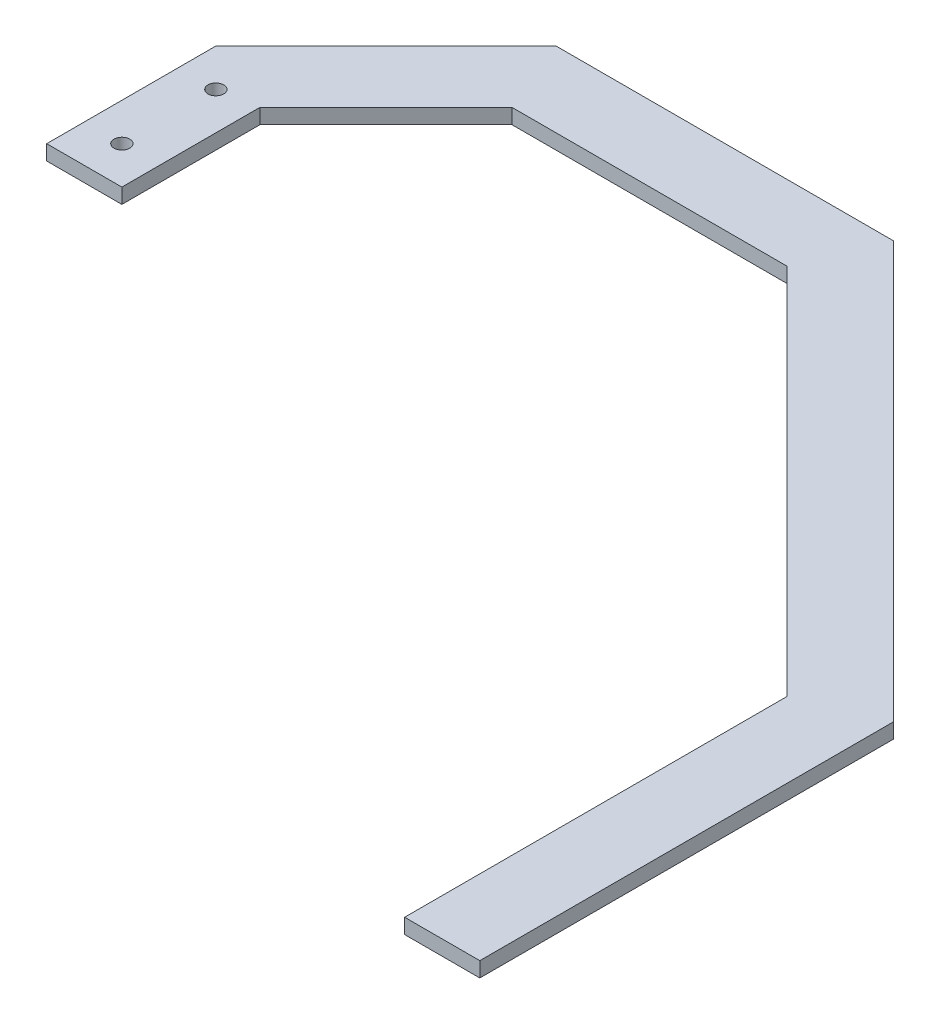
ISO-10303-21;
HEADER;
FILE_DESCRIPTION(('STEP AP214'),'2;1');
FILE_NAME('part.step','',(''),(''),'','','');
FILE_SCHEMA(('AUTOMOTIVE_DESIGN { 1 0 10303 214 1 1 1 1 }'));
ENDSEC;
DATA;
#1=APPLICATION_CONTEXT('core data for automotive mechanical design processes');
#2=APPLICATION_PROTOCOL_DEFINITION('international standard','automotive_design',2000,#1);
#3=PRODUCT_CONTEXT('',#1,'mechanical');
#4=PRODUCT('Part','Part','',(#3));
#5=PRODUCT_RELATED_PRODUCT_CATEGORY('part','',(#4));
#6=PRODUCT_DEFINITION_FORMATION('','',#4);
#7=PRODUCT_DEFINITION_CONTEXT('part definition',#1,'design');
#8=PRODUCT_DEFINITION('design','',#6,#7);
#9=PRODUCT_DEFINITION_SHAPE('','',#8);
#10=(LENGTH_UNIT() NAMED_UNIT(*) SI_UNIT(.MILLI.,.METRE.));
#11=(NAMED_UNIT(*) PLANE_ANGLE_UNIT() SI_UNIT($,.RADIAN.));
#12=(NAMED_UNIT(*) SI_UNIT($,.STERADIAN.) SOLID_ANGLE_UNIT());
#13=UNCERTAINTY_MEASURE_WITH_UNIT(LENGTH_MEASURE(1.E-05),#10,'distance_accuracy_value','');
#14=(GEOMETRIC_REPRESENTATION_CONTEXT(3) GLOBAL_UNCERTAINTY_ASSIGNED_CONTEXT((#13)) GLOBAL_UNIT_ASSIGNED_CONTEXT((#10,
#11,#12)) REPRESENTATION_CONTEXT('',''));
#15=CARTESIAN_POINT('',(0.,0.,0.));
#16=DIRECTION('',(0.,0.,1.));
#17=DIRECTION('',(1.,0.,0.));
#18=AXIS2_PLACEMENT_3D('',#15,#16,#17);
#19=CARTESIAN_POINT('',(0.,4.,0.));
#20=DIRECTION('',(0.,-1.,0.));
#21=DIRECTION('',(0.,0.,-1.));
#22=AXIS2_PLACEMENT_3D('',#19,#20,#21);
#23=PLANE('',#22);
#24=DIRECTION('',(0.,0.,1.));
#25=VECTOR('',#24,1.);
#26=CARTESIAN_POINT('',(0.,4.,0.));
#27=LINE('',#26,#25);
#28=CARTESIAN_POINT('',(0.,4.,-45.));
#29=VERTEX_POINT('',#28);
#30=CARTESIAN_POINT('',(0.,4.,0.));
#31=VERTEX_POINT('',#30);
#32=EDGE_CURVE('E183',#29,#31,#27,.T.);
#33=ORIENTED_EDGE('',*,*,#32,.T.);
#34=DIRECTION('',(1.,0.,0.));
#35=VECTOR('',#34,1.);
#36=CARTESIAN_POINT('',(20.,4.,0.));
#37=LINE('',#36,#35);
#38=CARTESIAN_POINT('',(20.,4.,0.));
#39=VERTEX_POINT('',#38);
#40=EDGE_CURVE('E111',#31,#39,#37,.T.);
#41=ORIENTED_EDGE('',*,*,#40,.T.);
#42=DIRECTION('',(0.,0.,-1.));
#43=VECTOR('',#42,1.);
#44=CARTESIAN_POINT('',(20.,4.,-36.7157287525354));
#45=LINE('',#44,#43);
#46=CARTESIAN_POINT('',(20.,4.,-36.7157287525354));
#47=VERTEX_POINT('',#46);
#48=EDGE_CURVE('E210',#39,#47,#45,.T.);
#49=ORIENTED_EDGE('',*,*,#48,.T.);
#50=DIRECTION('',(0.707106781186538,0.,-0.707106781186557));
#51=VECTOR('',#50,1.);
#52=CARTESIAN_POINT('',(53.5342712474645,4.,-70.2500000000008));
#53=LINE('',#52,#51);
#54=CARTESIAN_POINT('',(53.5342712474645,4.,-70.2500000000008));
#55=VERTEX_POINT('',#54);
#56=EDGE_CURVE('E229',#47,#55,#53,.T.);
#57=ORIENTED_EDGE('',*,*,#56,.T.);
#58=DIRECTION('',(1.,0.,0.));
#59=VECTOR('',#58,1.);
#60=CARTESIAN_POINT('',(126.683311442472,4.,-70.2500000000008));
#61=LINE('',#60,#59);
#62=CARTESIAN_POINT('',(126.683311442472,4.,-70.2500000000008));
#63=VERTEX_POINT('',#62);
#64=EDGE_CURVE('E226',#55,#63,#61,.T.);
#65=ORIENTED_EDGE('',*,*,#64,.T.);
#66=DIRECTION('',(0.707106781186546,0.,0.707106781186549));
#67=VECTOR('',#66,1.);
#68=CARTESIAN_POINT('',(225.824430246232,4.,28.8911188037598));
#69=LINE('',#68,#67);
#70=CARTESIAN_POINT('',(225.824430246232,4.,28.8911188037598));
#71=VERTEX_POINT('',#70);
#72=EDGE_CURVE('E228',#63,#71,#69,.T.);
#73=ORIENTED_EDGE('',*,*,#72,.T.);
#74=DIRECTION('',(0.,0.,1.));
#75=VECTOR('',#74,1.);
#76=CARTESIAN_POINT('',(225.824430246232,4.,130.606847556298));
#77=LINE('',#76,#75);
#78=CARTESIAN_POINT('',(225.824430246232,4.,130.606847556298));
#79=VERTEX_POINT('',#78);
#80=EDGE_CURVE('E231',#71,#79,#77,.T.);
#81=ORIENTED_EDGE('',*,*,#80,.T.);
#82=DIRECTION('',(1.,0.,0.));
#83=VECTOR('',#82,1.);
#84=CARTESIAN_POINT('',(245.824430246232,4.,130.606847556298));
#85=LINE('',#84,#83);
#86=CARTESIAN_POINT('',(245.824430246232,4.,130.606847556298));
#87=VERTEX_POINT('',#86);
#88=EDGE_CURVE('E237',#79,#87,#85,.T.);
#89=ORIENTED_EDGE('',*,*,#88,.T.);
#90=DIRECTION('',(0.,0.,-1.));
#91=VECTOR('',#90,1.);
#92=CARTESIAN_POINT('',(245.824430246232,4.,20.6068475562977));
#93=LINE('',#92,#91);
#94=CARTESIAN_POINT('',(245.824430246232,4.,20.6068475562977));
#95=VERTEX_POINT('',#94);
#96=EDGE_CURVE('E142',#87,#95,#93,.T.);
#97=ORIENTED_EDGE('',*,*,#96,.T.);
#98=DIRECTION('',(-0.707106781186547,0.,-0.707106781186549));
#99=VECTOR('',#98,1.);
#100=CARTESIAN_POINT('',(134.967582689934,4.,-90.2500000000008));
#101=LINE('',#100,#99);
#102=CARTESIAN_POINT('',(134.967582689934,4.,-90.2500000000008));
#103=VERTEX_POINT('',#102);
#104=EDGE_CURVE('E136',#95,#103,#101,.T.);
#105=ORIENTED_EDGE('',*,*,#104,.T.);
#106=DIRECTION('',(-1.,0.,0.));
#107=VECTOR('',#106,1.);
#108=CARTESIAN_POINT('',(45.2499999999996,4.,-90.2500000000008));
#109=LINE('',#108,#107);
#110=CARTESIAN_POINT('',(45.2499999999996,4.,-90.2500000000008));
#111=VERTEX_POINT('',#110);
#112=EDGE_CURVE('E140',#103,#111,#109,.T.);
#113=ORIENTED_EDGE('',*,*,#112,.T.);
#114=DIRECTION('',(-0.707106781186538,0.,0.707106781186557));
#115=VECTOR('',#114,1.);
#116=CARTESIAN_POINT('',(0.,4.,-45.));
#117=LINE('',#116,#115);
#118=EDGE_CURVE('E56',#111,#29,#117,.T.);
#119=ORIENTED_EDGE('',*,*,#118,.T.);
#120=EDGE_LOOP('',(#33,#41,#49,#57,#65,#73,#81,#89,#97,#105,#113,#119));
#121=FACE_BOUND('',#120,.T.);
#122=CARTESIAN_POINT('',(10.,4.,-10.));
#123=DIRECTION('',(0.,1.,0.));
#124=DIRECTION('',(0.,0.,1.));
#125=AXIS2_PLACEMENT_3D('',#122,#123,#124);
#126=CIRCLE('',#125,2.1);
#127=CARTESIAN_POINT('',(10.,4.,-7.9));
#128=VERTEX_POINT('',#127);
#129=EDGE_CURVE('E164',#128,#128,#126,.T.);
#130=ORIENTED_EDGE('',*,*,#129,.F.);
#131=EDGE_LOOP('',(#130));
#132=FACE_BOUND('',#131,.T.);
#133=CARTESIAN_POINT('',(10.,4.,-35.));
#134=DIRECTION('',(0.,1.,0.));
#135=DIRECTION('',(0.,0.,-1.));
#136=AXIS2_PLACEMENT_3D('',#133,#134,#135);
#137=CIRCLE('',#136,2.1);
#138=CARTESIAN_POINT('',(10.,4.,-37.1));
#139=VERTEX_POINT('',#138);
#140=EDGE_CURVE('E278',#139,#139,#137,.T.);
#141=ORIENTED_EDGE('',*,*,#140,.F.);
#142=EDGE_LOOP('',(#141));
#143=FACE_BOUND('',#142,.T.);
#144=ADVANCED_FACE('F39',(#121,#132,#143),#23,.F.);
#145=CARTESIAN_POINT('',(0.,0.,0.));
#146=DIRECTION('',(0.,-1.,0.));
#147=DIRECTION('',(0.,0.,-1.));
#148=AXIS2_PLACEMENT_3D('',#145,#146,#147);
#149=PLANE('',#148);
#150=CARTESIAN_POINT('',(10.,0.,-10.));
#151=DIRECTION('',(0.,1.,0.));
#152=DIRECTION('',(0.,0.,1.));
#153=AXIS2_PLACEMENT_3D('',#150,#151,#152);
#154=CIRCLE('',#153,2.1);
#155=CARTESIAN_POINT('',(10.,0.,-7.9));
#156=VERTEX_POINT('',#155);
#157=EDGE_CURVE('E283',#156,#156,#154,.T.);
#158=ORIENTED_EDGE('',*,*,#157,.T.);
#159=EDGE_LOOP('',(#158));
#160=FACE_BOUND('',#159,.T.);
#161=DIRECTION('',(0.,0.,1.));
#162=VECTOR('',#161,1.);
#163=CARTESIAN_POINT('',(0.,0.,0.));
#164=LINE('',#163,#162);
#165=CARTESIAN_POINT('',(0.,0.,-45.));
#166=VERTEX_POINT('',#165);
#167=CARTESIAN_POINT('',(0.,0.,0.));
#168=VERTEX_POINT('',#167);
#169=EDGE_CURVE('E160',#166,#168,#164,.T.);
#170=ORIENTED_EDGE('',*,*,#169,.F.);
#171=DIRECTION('',(-0.707106781186538,0.,0.707106781186557));
#172=VECTOR('',#171,1.);
#173=CARTESIAN_POINT('',(0.,0.,-45.));
#174=LINE('',#173,#172);
#175=CARTESIAN_POINT('',(45.2499999999996,0.,-90.2500000000008));
#176=VERTEX_POINT('',#175);
#177=EDGE_CURVE('E103',#176,#166,#174,.T.);
#178=ORIENTED_EDGE('',*,*,#177,.F.);
#179=DIRECTION('',(-1.,0.,0.));
#180=VECTOR('',#179,1.);
#181=CARTESIAN_POINT('',(45.2499999999996,0.,-90.2500000000008));
#182=LINE('',#181,#180);
#183=CARTESIAN_POINT('',(134.967582689934,0.,-90.2500000000008));
#184=VERTEX_POINT('',#183);
#185=EDGE_CURVE('E97',#184,#176,#182,.T.);
#186=ORIENTED_EDGE('',*,*,#185,.F.);
#187=DIRECTION('',(-0.707106781186547,0.,-0.707106781186549));
#188=VECTOR('',#187,1.);
#189=CARTESIAN_POINT('',(134.967582689934,0.,-90.2500000000008));
#190=LINE('',#189,#188);
#191=CARTESIAN_POINT('',(245.824430246232,0.,20.6068475562977));
#192=VERTEX_POINT('',#191);
#193=EDGE_CURVE('E150',#192,#184,#190,.T.);
#194=ORIENTED_EDGE('',*,*,#193,.F.);
#195=DIRECTION('',(0.,0.,-1.));
#196=VECTOR('',#195,1.);
#197=CARTESIAN_POINT('',(245.824430246232,0.,20.6068475562977));
#198=LINE('',#197,#196);
#199=CARTESIAN_POINT('',(245.824430246232,0.,130.606847556298));
#200=VERTEX_POINT('',#199);
#201=EDGE_CURVE('E178',#200,#192,#198,.T.);
#202=ORIENTED_EDGE('',*,*,#201,.F.);
#203=DIRECTION('',(1.,0.,0.));
#204=VECTOR('',#203,1.);
#205=CARTESIAN_POINT('',(245.824430246232,0.,130.606847556298));
#206=LINE('',#205,#204);
#207=CARTESIAN_POINT('',(225.824430246232,0.,130.606847556298));
#208=VERTEX_POINT('',#207);
#209=EDGE_CURVE('E176',#208,#200,#206,.T.);
#210=ORIENTED_EDGE('',*,*,#209,.F.);
#211=DIRECTION('',(0.,0.,1.));
#212=VECTOR('',#211,1.);
#213=CARTESIAN_POINT('',(225.824430246232,0.,130.606847556298));
#214=LINE('',#213,#212);
#215=CARTESIAN_POINT('',(225.824430246232,0.,28.8911188037598));
#216=VERTEX_POINT('',#215);
#217=EDGE_CURVE('E174',#216,#208,#214,.T.);
#218=ORIENTED_EDGE('',*,*,#217,.F.);
#219=DIRECTION('',(0.707106781186546,0.,0.707106781186549));
#220=VECTOR('',#219,1.);
#221=CARTESIAN_POINT('',(225.824430246232,0.,28.8911188037598));
#222=LINE('',#221,#220);
#223=CARTESIAN_POINT('',(126.683311442472,0.,-70.2500000000008));
#224=VERTEX_POINT('',#223);
#225=EDGE_CURVE('E172',#224,#216,#222,.T.);
#226=ORIENTED_EDGE('',*,*,#225,.F.);
#227=DIRECTION('',(1.,0.,0.));
#228=VECTOR('',#227,1.);
#229=CARTESIAN_POINT('',(126.683311442472,0.,-70.2500000000008));
#230=LINE('',#229,#228);
#231=CARTESIAN_POINT('',(53.5342712474645,0.,-70.2500000000008));
#232=VERTEX_POINT('',#231);
#233=EDGE_CURVE('E170',#232,#224,#230,.T.);
#234=ORIENTED_EDGE('',*,*,#233,.F.);
#235=DIRECTION('',(0.707106781186538,0.,-0.707106781186557));
#236=VECTOR('',#235,1.);
#237=CARTESIAN_POINT('',(53.5342712474645,0.,-70.2500000000008));
#238=LINE('',#237,#236);
#239=CARTESIAN_POINT('',(20.,0.,-36.7157287525354));
#240=VERTEX_POINT('',#239);
#241=EDGE_CURVE('E168',#240,#232,#238,.T.);
#242=ORIENTED_EDGE('',*,*,#241,.F.);
#243=DIRECTION('',(0.,0.,-1.));
#244=VECTOR('',#243,1.);
#245=CARTESIAN_POINT('',(20.,0.,-36.7157287525354));
#246=LINE('',#245,#244);
#247=CARTESIAN_POINT('',(20.,0.,0.));
#248=VERTEX_POINT('',#247);
#249=EDGE_CURVE('E166',#248,#240,#246,.T.);
#250=ORIENTED_EDGE('',*,*,#249,.F.);
#251=DIRECTION('',(1.,0.,0.));
#252=VECTOR('',#251,1.);
#253=CARTESIAN_POINT('',(20.,0.,0.));
#254=LINE('',#253,#252);
#255=EDGE_CURVE('E163',#168,#248,#254,.T.);
#256=ORIENTED_EDGE('',*,*,#255,.F.);
#257=EDGE_LOOP('',(#170,#178,#186,#194,#202,#210,#218,#226,#234,#242,#250,#256));
#258=FACE_BOUND('',#257,.T.);
#259=CARTESIAN_POINT('',(10.,0.,-35.));
#260=DIRECTION('',(0.,1.,0.));
#261=DIRECTION('',(0.,0.,-1.));
#262=AXIS2_PLACEMENT_3D('',#259,#260,#261);
#263=CIRCLE('',#262,2.1);
#264=CARTESIAN_POINT('',(10.,0.,-37.1));
#265=VERTEX_POINT('',#264);
#266=EDGE_CURVE('E281',#265,#265,#263,.T.);
#267=ORIENTED_EDGE('',*,*,#266,.T.);
#268=EDGE_LOOP('',(#267));
#269=FACE_BOUND('',#268,.T.);
#270=ADVANCED_FACE('F214',(#160,#258,#269),#149,.T.);
#271=CARTESIAN_POINT('',(0.,4.,0.));
#272=DIRECTION('',(1.,0.,0.));
#273=DIRECTION('',(0.,0.,-1.));
#274=AXIS2_PLACEMENT_3D('',#271,#272,#273);
#275=PLANE('',#274);
#276=ORIENTED_EDGE('',*,*,#169,.T.);
#277=DIRECTION('',(0.,-1.,0.));
#278=VECTOR('',#277,1.);
#279=CARTESIAN_POINT('',(0.,4.,0.));
#280=LINE('',#279,#278);
#281=EDGE_CURVE('E11',#31,#168,#280,.T.);
#282=ORIENTED_EDGE('',*,*,#281,.F.);
#283=ORIENTED_EDGE('',*,*,#32,.F.);
#284=DIRECTION('',(0.,-1.,0.));
#285=VECTOR('',#284,1.);
#286=CARTESIAN_POINT('',(0.,4.,-45.));
#287=LINE('',#286,#285);
#288=EDGE_CURVE('E156',#29,#166,#287,.T.);
#289=ORIENTED_EDGE('',*,*,#288,.T.);
#290=EDGE_LOOP('',(#276,#282,#283,#289));
#291=FACE_BOUND('',#290,.T.);
#292=ADVANCED_FACE('F41',(#291),#275,.F.);
#293=CARTESIAN_POINT('',(20.,4.,0.));
#294=DIRECTION('',(0.,0.,-1.));
#295=DIRECTION('',(-1.,0.,0.));
#296=AXIS2_PLACEMENT_3D('',#293,#294,#295);
#297=PLANE('',#296);
#298=ORIENTED_EDGE('',*,*,#255,.T.);
#299=DIRECTION('',(0.,-1.,0.));
#300=VECTOR('',#299,1.);
#301=CARTESIAN_POINT('',(20.,4.,0.));
#302=LINE('',#301,#300);
#303=EDGE_CURVE('E48',#39,#248,#302,.T.);
#304=ORIENTED_EDGE('',*,*,#303,.F.);
#305=ORIENTED_EDGE('',*,*,#40,.F.);
#306=ORIENTED_EDGE('',*,*,#281,.T.);
#307=EDGE_LOOP('',(#298,#304,#305,#306));
#308=FACE_BOUND('',#307,.T.);
#309=ADVANCED_FACE('F380',(#308),#297,.F.);
#310=CARTESIAN_POINT('',(20.,4.,-36.7157287525354));
#311=DIRECTION('',(-1.,0.,0.));
#312=DIRECTION('',(0.,0.,1.));
#313=AXIS2_PLACEMENT_3D('',#310,#311,#312);
#314=PLANE('',#313);
#315=ORIENTED_EDGE('',*,*,#249,.T.);
#316=DIRECTION('',(0.,-1.,0.));
#317=VECTOR('',#316,1.);
#318=CARTESIAN_POINT('',(20.,4.,-36.7157287525354));
#319=LINE('',#318,#317);
#320=EDGE_CURVE('E202',#47,#240,#319,.T.);
#321=ORIENTED_EDGE('',*,*,#320,.F.);
#322=ORIENTED_EDGE('',*,*,#48,.F.);
#323=ORIENTED_EDGE('',*,*,#303,.T.);
#324=EDGE_LOOP('',(#315,#321,#322,#323));
#325=FACE_BOUND('',#324,.T.);
#326=ADVANCED_FACE('F208',(#325),#314,.F.);
#327=CARTESIAN_POINT('',(53.5342712474645,4.,-70.2500000000008));
#328=DIRECTION('',(-0.707106781186557,0.,-0.707106781186538));
#329=DIRECTION('',(-0.707106781186538,0.,0.707106781186557));
#330=AXIS2_PLACEMENT_3D('',#327,#328,#329);
#331=PLANE('',#330);
#332=ORIENTED_EDGE('',*,*,#241,.T.);
#333=DIRECTION('',(0.,-1.,0.));
#334=VECTOR('',#333,1.);
#335=CARTESIAN_POINT('',(53.5342712474645,4.,-70.2500000000008));
#336=LINE('',#335,#334);
#337=EDGE_CURVE('E199',#55,#232,#336,.T.);
#338=ORIENTED_EDGE('',*,*,#337,.F.);
#339=ORIENTED_EDGE('',*,*,#56,.F.);
#340=ORIENTED_EDGE('',*,*,#320,.T.);
#341=EDGE_LOOP('',(#332,#338,#339,#340));
#342=FACE_BOUND('',#341,.T.);
#343=ADVANCED_FACE('F220',(#342),#331,.F.);
#344=CARTESIAN_POINT('',(126.683311442472,4.,-70.2500000000008));
#345=DIRECTION('',(0.,0.,-1.));
#346=DIRECTION('',(-1.,0.,0.));
#347=AXIS2_PLACEMENT_3D('',#344,#345,#346);
#348=PLANE('',#347);
#349=ORIENTED_EDGE('',*,*,#233,.T.);
#350=DIRECTION('',(0.,-1.,0.));
#351=VECTOR('',#350,1.);
#352=CARTESIAN_POINT('',(126.683311442472,4.,-70.2500000000008));
#353=LINE('',#352,#351);
#354=EDGE_CURVE('E196',#63,#224,#353,.T.);
#355=ORIENTED_EDGE('',*,*,#354,.F.);
#356=ORIENTED_EDGE('',*,*,#64,.F.);
#357=ORIENTED_EDGE('',*,*,#337,.T.);
#358=EDGE_LOOP('',(#349,#355,#356,#357));
#359=FACE_BOUND('',#358,.T.);
#360=ADVANCED_FACE('F224',(#359),#348,.F.);
#361=CARTESIAN_POINT('',(225.824430246232,4.,28.8911188037598));
#362=DIRECTION('',(0.707106781186549,0.,-0.707106781186546));
#363=DIRECTION('',(-0.707106781186546,0.,-0.707106781186549));
#364=AXIS2_PLACEMENT_3D('',#361,#362,#363);
#365=PLANE('',#364);
#366=ORIENTED_EDGE('',*,*,#225,.T.);
#367=DIRECTION('',(0.,-1.,0.));
#368=VECTOR('',#367,1.);
#369=CARTESIAN_POINT('',(225.824430246232,4.,28.8911188037598));
#370=LINE('',#369,#368);
#371=EDGE_CURVE('E193',#71,#216,#370,.T.);
#372=ORIENTED_EDGE('',*,*,#371,.F.);
#373=ORIENTED_EDGE('',*,*,#72,.F.);
#374=ORIENTED_EDGE('',*,*,#354,.T.);
#375=EDGE_LOOP('',(#366,#372,#373,#374));
#376=FACE_BOUND('',#375,.T.);
#377=ADVANCED_FACE('F345',(#376),#365,.F.);
#378=CARTESIAN_POINT('',(225.824430246232,4.,130.606847556298));
#379=DIRECTION('',(1.,0.,0.));
#380=DIRECTION('',(0.,0.,-1.));
#381=AXIS2_PLACEMENT_3D('',#378,#379,#380);
#382=PLANE('',#381);
#383=ORIENTED_EDGE('',*,*,#217,.T.);
#384=DIRECTION('',(0.,-1.,0.));
#385=VECTOR('',#384,1.);
#386=CARTESIAN_POINT('',(225.824430246232,4.,130.606847556298));
#387=LINE('',#386,#385);
#388=EDGE_CURVE('E190',#79,#208,#387,.T.);
#389=ORIENTED_EDGE('',*,*,#388,.F.);
#390=ORIENTED_EDGE('',*,*,#80,.F.);
#391=ORIENTED_EDGE('',*,*,#371,.T.);
#392=EDGE_LOOP('',(#383,#389,#390,#391));
#393=FACE_BOUND('',#392,.T.);
#394=ADVANCED_FACE('F336',(#393),#382,.F.);
#395=CARTESIAN_POINT('',(245.824430246232,4.,130.606847556298));
#396=DIRECTION('',(0.,0.,-1.));
#397=DIRECTION('',(-1.,0.,0.));
#398=AXIS2_PLACEMENT_3D('',#395,#396,#397);
#399=PLANE('',#398);
#400=ORIENTED_EDGE('',*,*,#209,.T.);
#401=DIRECTION('',(0.,-1.,0.));
#402=VECTOR('',#401,1.);
#403=CARTESIAN_POINT('',(245.824430246232,4.,130.606847556298));
#404=LINE('',#403,#402);
#405=EDGE_CURVE('E187',#87,#200,#404,.T.);
#406=ORIENTED_EDGE('',*,*,#405,.F.);
#407=ORIENTED_EDGE('',*,*,#88,.F.);
#408=ORIENTED_EDGE('',*,*,#388,.T.);
#409=EDGE_LOOP('',(#400,#406,#407,#408));
#410=FACE_BOUND('',#409,.T.);
#411=ADVANCED_FACE('F243',(#410),#399,.F.);
#412=CARTESIAN_POINT('',(245.824430246232,4.,20.6068475562977));
#413=DIRECTION('',(-1.,0.,0.));
#414=DIRECTION('',(0.,0.,1.));
#415=AXIS2_PLACEMENT_3D('',#412,#413,#414);
#416=PLANE('',#415);
#417=ORIENTED_EDGE('',*,*,#201,.T.);
#418=DIRECTION('',(0.,-1.,0.));
#419=VECTOR('',#418,1.);
#420=CARTESIAN_POINT('',(245.824430246232,4.,20.6068475562977));
#421=LINE('',#420,#419);
#422=EDGE_CURVE('E151',#95,#192,#421,.T.);
#423=ORIENTED_EDGE('',*,*,#422,.F.);
#424=ORIENTED_EDGE('',*,*,#96,.F.);
#425=ORIENTED_EDGE('',*,*,#405,.T.);
#426=EDGE_LOOP('',(#417,#423,#424,#425));
#427=FACE_BOUND('',#426,.T.);
#428=ADVANCED_FACE('F247',(#427),#416,.F.);
#429=CARTESIAN_POINT('',(134.967582689934,4.,-90.2500000000008));
#430=DIRECTION('',(-0.707106781186549,0.,0.707106781186547));
#431=DIRECTION('',(0.707106781186547,0.,0.707106781186549));
#432=AXIS2_PLACEMENT_3D('',#429,#430,#431);
#433=PLANE('',#432);
#434=ORIENTED_EDGE('',*,*,#193,.T.);
#435=DIRECTION('',(0.,-1.,0.));
#436=VECTOR('',#435,1.);
#437=CARTESIAN_POINT('',(134.967582689934,4.,-90.2500000000008));
#438=LINE('',#437,#436);
#439=EDGE_CURVE('E147',#103,#184,#438,.T.);
#440=ORIENTED_EDGE('',*,*,#439,.F.);
#441=ORIENTED_EDGE('',*,*,#104,.F.);
#442=ORIENTED_EDGE('',*,*,#422,.T.);
#443=EDGE_LOOP('',(#434,#440,#441,#442));
#444=FACE_BOUND('',#443,.T.);
#445=ADVANCED_FACE('F148',(#444),#433,.F.);
#446=CARTESIAN_POINT('',(45.2499999999996,4.,-90.2500000000008));
#447=DIRECTION('',(0.,0.,1.));
#448=DIRECTION('',(1.,0.,0.));
#449=AXIS2_PLACEMENT_3D('',#446,#447,#448);
#450=PLANE('',#449);
#451=ORIENTED_EDGE('',*,*,#185,.T.);
#452=DIRECTION('',(0.,-1.,0.));
#453=VECTOR('',#452,1.);
#454=CARTESIAN_POINT('',(45.2499999999996,4.,-90.2500000000008));
#455=LINE('',#454,#453);
#456=EDGE_CURVE('E152',#111,#176,#455,.T.);
#457=ORIENTED_EDGE('',*,*,#456,.F.);
#458=ORIENTED_EDGE('',*,*,#112,.F.);
#459=ORIENTED_EDGE('',*,*,#439,.T.);
#460=EDGE_LOOP('',(#451,#457,#458,#459));
#461=FACE_BOUND('',#460,.T.);
#462=ADVANCED_FACE('F154',(#461),#450,.F.);
#463=CARTESIAN_POINT('',(0.,4.,-45.));
#464=DIRECTION('',(0.707106781186557,0.,0.707106781186538));
#465=DIRECTION('',(0.707106781186538,0.,-0.707106781186557));
#466=AXIS2_PLACEMENT_3D('',#463,#464,#465);
#467=PLANE('',#466);
#468=ORIENTED_EDGE('',*,*,#177,.T.);
#469=ORIENTED_EDGE('',*,*,#288,.F.);
#470=ORIENTED_EDGE('',*,*,#118,.F.);
#471=ORIENTED_EDGE('',*,*,#456,.T.);
#472=EDGE_LOOP('',(#468,#469,#470,#471));
#473=FACE_BOUND('',#472,.T.);
#474=ADVANCED_FACE('F251',(#473),#467,.F.);
#475=CARTESIAN_POINT('',(10.,4.,-10.));
#476=DIRECTION('',(0.,-1.,0.));
#477=DIRECTION('',(0.,0.,-1.));
#478=AXIS2_PLACEMENT_3D('',#475,#476,#477);
#479=CYLINDRICAL_SURFACE('',#478,2.1);
#480=ORIENTED_EDGE('',*,*,#129,.T.);
#481=EDGE_LOOP('',(#480));
#482=FACE_BOUND('',#481,.T.);
#483=ORIENTED_EDGE('',*,*,#157,.F.);
#484=EDGE_LOOP('',(#483));
#485=FACE_BOUND('',#484,.T.);
#486=ADVANCED_FACE('F253',(#482,#485),#479,.F.);
#487=CARTESIAN_POINT('',(10.,4.,-35.));
#488=DIRECTION('',(0.,-1.,0.));
#489=DIRECTION('',(0.,0.,-1.));
#490=AXIS2_PLACEMENT_3D('',#487,#488,#489);
#491=CYLINDRICAL_SURFACE('',#490,2.1);
#492=ORIENTED_EDGE('',*,*,#140,.T.);
#493=EDGE_LOOP('',(#492));
#494=FACE_BOUND('',#493,.T.);
#495=ORIENTED_EDGE('',*,*,#266,.F.);
#496=EDGE_LOOP('',(#495));
#497=FACE_BOUND('',#496,.T.);
#498=ADVANCED_FACE('F259',(#494,#497),#491,.F.);
#499=CLOSED_SHELL('',(#144,#270,#292,#309,#326,#343,#360,#377,#394,#411,#428,#445,#462,#474,
#486,#498));
#500=MANIFOLD_SOLID_BREP('B2',#499);
#501=ADVANCED_BREP_SHAPE_REPRESENTATION('',(#18,#500),#14);
#502=SHAPE_DEFINITION_REPRESENTATION(#9,#501);
ENDSEC;
END-ISO-10303-21;
